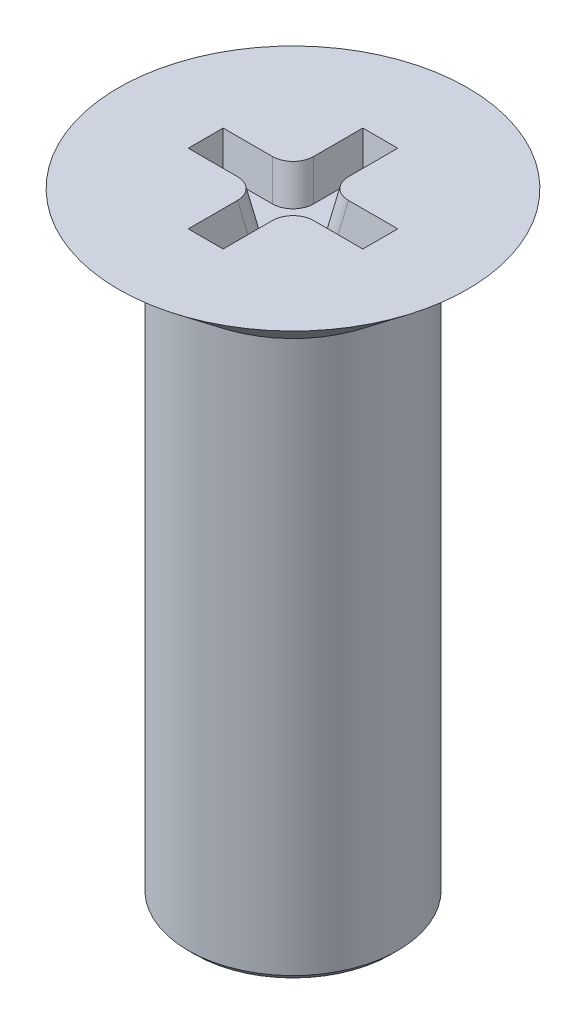
ISO-10303-21;
HEADER;
FILE_DESCRIPTION(('STEP AP214'),'2;1');
FILE_NAME('part.step','',(''),(''),'','','');
FILE_SCHEMA(('AUTOMOTIVE_DESIGN { 1 0 10303 214 1 1 1 1 }'));
ENDSEC;
DATA;
#1=APPLICATION_CONTEXT('core data for automotive mechanical design processes');
#2=APPLICATION_PROTOCOL_DEFINITION('international standard','automotive_design',2000,#1);
#3=PRODUCT_CONTEXT('',#1,'mechanical');
#4=PRODUCT('Part','Part','',(#3));
#5=PRODUCT_RELATED_PRODUCT_CATEGORY('part','',(#4));
#6=PRODUCT_DEFINITION_FORMATION('','',#4);
#7=PRODUCT_DEFINITION_CONTEXT('part definition',#1,'design');
#8=PRODUCT_DEFINITION('design','',#6,#7);
#9=PRODUCT_DEFINITION_SHAPE('','',#8);
#10=(LENGTH_UNIT() NAMED_UNIT(*) SI_UNIT(.MILLI.,.METRE.));
#11=(NAMED_UNIT(*) PLANE_ANGLE_UNIT() SI_UNIT($,.RADIAN.));
#12=(NAMED_UNIT(*) SI_UNIT($,.STERADIAN.) SOLID_ANGLE_UNIT());
#13=UNCERTAINTY_MEASURE_WITH_UNIT(LENGTH_MEASURE(1.E-05),#10,'distance_accuracy_value','');
#14=(GEOMETRIC_REPRESENTATION_CONTEXT(3) GLOBAL_UNCERTAINTY_ASSIGNED_CONTEXT((#13)) GLOBAL_UNIT_ASSIGNED_CONTEXT((#10,
#11,#12)) REPRESENTATION_CONTEXT('',''));
#15=CARTESIAN_POINT('',(0.,0.,0.));
#16=DIRECTION('',(0.,0.,1.));
#17=DIRECTION('',(1.,0.,0.));
#18=AXIS2_PLACEMENT_3D('',#15,#16,#17);
#19=CARTESIAN_POINT('',(0.,0.,0.));
#20=DIRECTION('',(0.,1.,0.));
#21=DIRECTION('',(0.,0.,1.));
#22=AXIS2_PLACEMENT_3D('',#19,#20,#21);
#23=PLANE('',#22);
#24=CARTESIAN_POINT('',(0.,0.,0.));
#25=DIRECTION('',(0.,-1.,0.));
#26=DIRECTION('',(0.,0.,-1.));
#27=AXIS2_PLACEMENT_3D('',#24,#25,#26);
#28=CIRCLE('',#27,2.5);
#29=CARTESIAN_POINT('',(0.,0.,-2.5));
#30=VERTEX_POINT('',#29);
#31=EDGE_CURVE('E256',#30,#30,#28,.T.);
#32=ORIENTED_EDGE('',*,*,#31,.F.);
#33=EDGE_LOOP('',(#32));
#34=FACE_BOUND('',#33,.T.);
#35=DIRECTION('',(1.,0.,0.));
#36=VECTOR('',#35,1.);
#37=CARTESIAN_POINT('',(0.,0.,-0.25));
#38=LINE('',#37,#36);
#39=CARTESIAN_POINT('',(-1.25,0.,-0.25));
#40=VERTEX_POINT('',#39);
#41=CARTESIAN_POINT('',(-0.545442325903662,0.,-0.25));
#42=VERTEX_POINT('',#41);
#43=EDGE_CURVE('E186',#40,#42,#38,.T.);
#44=ORIENTED_EDGE('',*,*,#43,.T.);
#45=CARTESIAN_POINT('',(-0.554627983565723,0.,-0.554627983565723));
#46=DIRECTION('',(0.,1.,0.));
#47=DIRECTION('',(-0.707106781186548,0.,-0.707106781186547));
#48=AXIS2_PLACEMENT_3D('',#45,#46,#47);
#49=ELLIPSE('',#48,0.309186702079241,0.3);
#50=CARTESIAN_POINT('',(-0.25,0.,-0.545442325903662));
#51=VERTEX_POINT('',#50);
#52=EDGE_CURVE('E274',#42,#51,#49,.T.);
#53=ORIENTED_EDGE('',*,*,#52,.T.);
#54=DIRECTION('',(0.,0.,1.));
#55=VECTOR('',#54,1.);
#56=CARTESIAN_POINT('',(-0.25,0.,0.));
#57=LINE('',#56,#55);
#58=CARTESIAN_POINT('',(-0.25,0.,-1.25));
#59=VERTEX_POINT('',#58);
#60=EDGE_CURVE('E184',#59,#51,#57,.T.);
#61=ORIENTED_EDGE('',*,*,#60,.F.);
#62=DIRECTION('',(1.,0.,0.));
#63=VECTOR('',#62,1.);
#64=CARTESIAN_POINT('',(0.,0.,-1.25));
#65=LINE('',#64,#63);
#66=CARTESIAN_POINT('',(0.25,0.,-1.25));
#67=VERTEX_POINT('',#66);
#68=EDGE_CURVE('E163',#59,#67,#65,.T.);
#69=ORIENTED_EDGE('',*,*,#68,.T.);
#70=DIRECTION('',(0.,0.,1.));
#71=VECTOR('',#70,1.);
#72=CARTESIAN_POINT('',(0.25,0.,0.));
#73=LINE('',#72,#71);
#74=CARTESIAN_POINT('',(0.25,0.,-0.545442325903662));
#75=VERTEX_POINT('',#74);
#76=EDGE_CURVE('E175',#67,#75,#73,.T.);
#77=ORIENTED_EDGE('',*,*,#76,.T.);
#78=CARTESIAN_POINT('',(0.554627983565724,0.,-0.554627983565723));
#79=DIRECTION('',(0.,1.,0.));
#80=DIRECTION('',(0.707106781186547,0.,-0.707106781186548));
#81=AXIS2_PLACEMENT_3D('',#78,#79,#80);
#82=ELLIPSE('',#81,0.309186702079241,0.3);
#83=CARTESIAN_POINT('',(0.545442325903663,0.,-0.25));
#84=VERTEX_POINT('',#83);
#85=EDGE_CURVE('E272',#75,#84,#82,.T.);
#86=ORIENTED_EDGE('',*,*,#85,.T.);
#87=DIRECTION('',(1.,0.,0.));
#88=VECTOR('',#87,1.);
#89=CARTESIAN_POINT('',(0.,0.,-0.25));
#90=LINE('',#89,#88);
#91=CARTESIAN_POINT('',(1.25,0.,-0.25));
#92=VERTEX_POINT('',#91);
#93=EDGE_CURVE('E180',#84,#92,#90,.T.);
#94=ORIENTED_EDGE('',*,*,#93,.T.);
#95=DIRECTION('',(0.,0.,-1.));
#96=VECTOR('',#95,1.);
#97=CARTESIAN_POINT('',(1.25,0.,0.));
#98=LINE('',#97,#96);
#99=CARTESIAN_POINT('',(1.25,0.,0.25));
#100=VERTEX_POINT('',#99);
#101=EDGE_CURVE('E206',#100,#92,#98,.T.);
#102=ORIENTED_EDGE('',*,*,#101,.F.);
#103=DIRECTION('',(1.,0.,0.));
#104=VECTOR('',#103,1.);
#105=CARTESIAN_POINT('',(0.,0.,0.25));
#106=LINE('',#105,#104);
#107=CARTESIAN_POINT('',(0.545442325903663,0.,0.25));
#108=VERTEX_POINT('',#107);
#109=EDGE_CURVE('E204',#108,#100,#106,.T.);
#110=ORIENTED_EDGE('',*,*,#109,.F.);
#111=CARTESIAN_POINT('',(0.554627983565724,0.,0.554627983565724));
#112=DIRECTION('',(0.,1.,0.));
#113=DIRECTION('',(0.707106781186548,0.,0.707106781186547));
#114=AXIS2_PLACEMENT_3D('',#111,#112,#113);
#115=ELLIPSE('',#114,0.309186702079241,0.3);
#116=CARTESIAN_POINT('',(0.25,0.,0.545442325903663));
#117=VERTEX_POINT('',#116);
#118=EDGE_CURVE('E268',#108,#117,#115,.T.);
#119=ORIENTED_EDGE('',*,*,#118,.T.);
#120=DIRECTION('',(0.,0.,1.));
#121=VECTOR('',#120,1.);
#122=CARTESIAN_POINT('',(0.25,0.,0.));
#123=LINE('',#122,#121);
#124=CARTESIAN_POINT('',(0.250000000000001,0.,1.25));
#125=VERTEX_POINT('',#124);
#126=EDGE_CURVE('E202',#117,#125,#123,.T.);
#127=ORIENTED_EDGE('',*,*,#126,.T.);
#128=DIRECTION('',(1.,0.,0.));
#129=VECTOR('',#128,1.);
#130=CARTESIAN_POINT('',(0.,0.,1.25));
#131=LINE('',#130,#129);
#132=CARTESIAN_POINT('',(-0.249999999999999,0.,1.25));
#133=VERTEX_POINT('',#132);
#134=EDGE_CURVE('E199',#133,#125,#131,.T.);
#135=ORIENTED_EDGE('',*,*,#134,.F.);
#136=DIRECTION('',(0.,0.,1.));
#137=VECTOR('',#136,1.);
#138=CARTESIAN_POINT('',(-0.25,0.,0.));
#139=LINE('',#138,#137);
#140=CARTESIAN_POINT('',(-0.25,0.,0.545442325903662));
#141=VERTEX_POINT('',#140);
#142=EDGE_CURVE('E197',#141,#133,#139,.T.);
#143=ORIENTED_EDGE('',*,*,#142,.F.);
#144=CARTESIAN_POINT('',(-0.554627983565723,0.,0.554627983565724));
#145=DIRECTION('',(0.,1.,0.));
#146=DIRECTION('',(-0.707106781186547,0.,0.707106781186548));
#147=AXIS2_PLACEMENT_3D('',#144,#145,#146);
#148=ELLIPSE('',#147,0.309186702079241,0.3);
#149=CARTESIAN_POINT('',(-0.545442325903662,0.,0.25));
#150=VERTEX_POINT('',#149);
#151=EDGE_CURVE('E270',#141,#150,#148,.T.);
#152=ORIENTED_EDGE('',*,*,#151,.T.);
#153=DIRECTION('',(1.,0.,0.));
#154=VECTOR('',#153,1.);
#155=CARTESIAN_POINT('',(0.,0.,0.25));
#156=LINE('',#155,#154);
#157=CARTESIAN_POINT('',(-1.25,0.,0.25));
#158=VERTEX_POINT('',#157);
#159=EDGE_CURVE('E194',#158,#150,#156,.T.);
#160=ORIENTED_EDGE('',*,*,#159,.F.);
#161=DIRECTION('',(0.,0.,-1.));
#162=VECTOR('',#161,1.);
#163=CARTESIAN_POINT('',(-1.25,0.,0.));
#164=LINE('',#163,#162);
#165=EDGE_CURVE('E191',#158,#40,#164,.T.);
#166=ORIENTED_EDGE('',*,*,#165,.T.);
#167=EDGE_LOOP('',(#44,#53,#61,#69,#77,#86,#94,#102,#110,#119,#127,#135,#143,#152,#160,#166));
#168=FACE_BOUND('',#167,.T.);
#169=ADVANCED_FACE('F47',(#34,#168),#23,.T.);
#170=CARTESIAN_POINT('',(0.,-0.8,0.));
#171=DIRECTION('',(0.,1.,0.));
#172=DIRECTION('',(0.,0.,1.));
#173=AXIS2_PLACEMENT_3D('',#170,#171,#172);
#174=CONICAL_SURFACE('',#173,1.5,0.896055384571344);
#175=ORIENTED_EDGE('',*,*,#31,.T.);
#176=EDGE_LOOP('',(#175));
#177=FACE_BOUND('',#176,.T.);
#178=CARTESIAN_POINT('',(0.,-0.8,0.));
#179=DIRECTION('',(0.,-1.,0.));
#180=DIRECTION('',(0.,0.,-1.));
#181=AXIS2_PLACEMENT_3D('',#178,#179,#180);
#182=CIRCLE('',#181,1.5);
#183=CARTESIAN_POINT('',(0.,-0.8,-1.5));
#184=VERTEX_POINT('',#183);
#185=EDGE_CURVE('E212',#184,#184,#182,.T.);
#186=ORIENTED_EDGE('',*,*,#185,.F.);
#187=EDGE_LOOP('',(#186));
#188=FACE_BOUND('',#187,.T.);
#189=ADVANCED_FACE('F351',(#177,#188),#174,.T.);
#190=CARTESIAN_POINT('',(0.,-8.8,0.));
#191=DIRECTION('',(0.,1.,0.));
#192=DIRECTION('',(0.,0.,1.));
#193=AXIS2_PLACEMENT_3D('',#190,#191,#192);
#194=CYLINDRICAL_SURFACE('',#193,1.5);
#195=CARTESIAN_POINT('',(0.,-8.7,0.));
#196=DIRECTION('',(0.,-1.,0.));
#197=DIRECTION('',(0.,0.,-1.));
#198=AXIS2_PLACEMENT_3D('',#195,#196,#197);
#199=CIRCLE('',#198,1.5);
#200=CARTESIAN_POINT('',(0.,-8.7,-1.5));
#201=VERTEX_POINT('',#200);
#202=EDGE_CURVE('E262',#201,#201,#199,.F.);
#203=ORIENTED_EDGE('',*,*,#202,.T.);
#204=EDGE_LOOP('',(#203));
#205=FACE_BOUND('',#204,.T.);
#206=ORIENTED_EDGE('',*,*,#185,.T.);
#207=EDGE_LOOP('',(#206));
#208=FACE_BOUND('',#207,.T.);
#209=ADVANCED_FACE('F359',(#205,#208),#194,.T.);
#210=CARTESIAN_POINT('',(0.,-8.8,0.));
#211=DIRECTION('',(0.,-1.,0.));
#212=DIRECTION('',(0.,0.,-1.));
#213=AXIS2_PLACEMENT_3D('',#210,#211,#212);
#214=PLANE('',#213);
#215=CARTESIAN_POINT('',(0.,-8.8,0.));
#216=DIRECTION('',(0.,-1.,0.));
#217=DIRECTION('',(0.,0.,-1.));
#218=AXIS2_PLACEMENT_3D('',#215,#216,#217);
#219=CIRCLE('',#218,1.4);
#220=CARTESIAN_POINT('',(0.,-8.8,-1.4));
#221=VERTEX_POINT('',#220);
#222=EDGE_CURVE('E259',#221,#221,#219,.T.);
#223=ORIENTED_EDGE('',*,*,#222,.T.);
#224=EDGE_LOOP('',(#223));
#225=FACE_BOUND('',#224,.T.);
#226=ADVANCED_FACE('F371',(#225),#214,.T.);
#227=CARTESIAN_POINT('',(0.,-8.8,0.));
#228=DIRECTION('',(0.,1.,0.));
#229=DIRECTION('',(0.,0.,1.));
#230=AXIS2_PLACEMENT_3D('',#227,#228,#229);
#231=CONICAL_SURFACE('',#230,1.4,0.785398163397453);
#232=ORIENTED_EDGE('',*,*,#202,.F.);
#233=EDGE_LOOP('',(#232));
#234=FACE_BOUND('',#233,.T.);
#235=ORIENTED_EDGE('',*,*,#222,.F.);
#236=EDGE_LOOP('',(#235));
#237=FACE_BOUND('',#236,.T.);
#238=ADVANCED_FACE('F366',(#234,#237),#231,.T.);
#239=CARTESIAN_POINT('',(0.,0.,-0.25));
#240=DIRECTION('',(0.,-0.17364817766693,-0.984807753012208));
#241=DIRECTION('',(0.,0.984807753012208,-0.17364817766693));
#242=AXIS2_PLACEMENT_3D('',#239,#240,#241);
#243=PLANE('',#242);
#244=ORIENTED_EDGE('',*,*,#93,.F.);
#245=DIRECTION('',(-0.171087869746036,-0.970287525247814,0.171087869746036));
#246=VECTOR('',#245,1.);
#247=CARTESIAN_POINT('',(0.529476651306003,-0.0905458400836372,-0.234034325402341));
#248=LINE('',#247,#246);
#249=CARTESIAN_POINT('',(0.45727883554943,-0.5,-0.161836509645767));
#250=VERTEX_POINT('',#249);
#251=EDGE_CURVE('E279',#84,#250,#248,.T.);
#252=ORIENTED_EDGE('',*,*,#251,.T.);
#253=DIRECTION('',(-1.,0.,0.));
#254=VECTOR('',#253,1.);
#255=CARTESIAN_POINT('',(0.,-0.5,-0.161836509645767));
#256=LINE('',#255,#254);
#257=CARTESIAN_POINT('',(1.16183650964577,-0.5,-0.161836509645767));
#258=VERTEX_POINT('',#257);
#259=EDGE_CURVE('E209',#250,#258,#256,.F.);
#260=ORIENTED_EDGE('',*,*,#259,.T.);
#261=DIRECTION('',(-0.171087869746036,-0.970287525247814,0.171087869746036));
#262=VECTOR('',#261,1.);
#263=CARTESIAN_POINT('',(1.2134111760322,-0.207505532169751,-0.213411176032204));
#264=LINE('',#263,#262);
#265=EDGE_CURVE('E210',#258,#92,#264,.F.);
#266=ORIENTED_EDGE('',*,*,#265,.T.);
#267=EDGE_LOOP('',(#244,#252,#260,#266));
#268=FACE_BOUND('',#267,.T.);
#269=ADVANCED_FACE('F335',(#268),#243,.F.);
#270=CARTESIAN_POINT('',(1.25,0.,0.));
#271=DIRECTION('',(0.984807753012208,-0.17364817766693,0.));
#272=DIRECTION('',(0.17364817766693,0.984807753012208,0.));
#273=AXIS2_PLACEMENT_3D('',#270,#271,#272);
#274=PLANE('',#273);
#275=ORIENTED_EDGE('',*,*,#101,.T.);
#276=ORIENTED_EDGE('',*,*,#265,.F.);
#277=DIRECTION('',(0.,0.,-1.));
#278=VECTOR('',#277,1.);
#279=CARTESIAN_POINT('',(1.16183650964577,-0.5,0.));
#280=LINE('',#279,#278);
#281=CARTESIAN_POINT('',(1.16183650964577,-0.5,0.161836509645768));
#282=VERTEX_POINT('',#281);
#283=EDGE_CURVE('E171',#282,#258,#280,.T.);
#284=ORIENTED_EDGE('',*,*,#283,.F.);
#285=DIRECTION('',(0.171087869746036,0.970287525247814,0.171087869746036));
#286=VECTOR('',#285,1.);
#287=CARTESIAN_POINT('',(1.2134111760322,-0.207505532169751,0.213411176032205));
#288=LINE('',#287,#286);
#289=EDGE_CURVE('E213',#282,#100,#288,.T.);
#290=ORIENTED_EDGE('',*,*,#289,.T.);
#291=EDGE_LOOP('',(#275,#276,#284,#290));
#292=FACE_BOUND('',#291,.T.);
#293=ADVANCED_FACE('F339',(#292),#274,.F.);
#294=CARTESIAN_POINT('',(0.,0.,0.25));
#295=DIRECTION('',(0.,-0.17364817766693,0.984807753012208));
#296=DIRECTION('',(0.,-0.984807753012208,-0.17364817766693));
#297=AXIS2_PLACEMENT_3D('',#294,#295,#296);
#298=PLANE('',#297);
#299=DIRECTION('',(1.,0.,0.));
#300=VECTOR('',#299,1.);
#301=CARTESIAN_POINT('',(0.,-0.5,0.161836509645768));
#302=LINE('',#301,#300);
#303=CARTESIAN_POINT('',(0.45727883554943,-0.5,0.161836509645768));
#304=VERTEX_POINT('',#303);
#305=EDGE_CURVE('E232',#304,#282,#302,.T.);
#306=ORIENTED_EDGE('',*,*,#305,.F.);
#307=DIRECTION('',(-0.171087869746036,-0.970287525247814,-0.171087869746036));
#308=VECTOR('',#307,1.);
#309=CARTESIAN_POINT('',(0.536794416099563,-0.049044733649687,0.2413520901959));
#310=LINE('',#309,#308);
#311=EDGE_CURVE('E286',#304,#108,#310,.F.);
#312=ORIENTED_EDGE('',*,*,#311,.T.);
#313=ORIENTED_EDGE('',*,*,#109,.T.);
#314=ORIENTED_EDGE('',*,*,#289,.F.);
#315=EDGE_LOOP('',(#306,#312,#313,#314));
#316=FACE_BOUND('',#315,.T.);
#317=ADVANCED_FACE('F343',(#316),#298,.F.);
#318=CARTESIAN_POINT('',(0.25,0.,0.));
#319=DIRECTION('',(0.984807753012208,-0.17364817766693,0.));
#320=DIRECTION('',(0.17364817766693,0.984807753012208,0.));
#321=AXIS2_PLACEMENT_3D('',#318,#319,#320);
#322=PLANE('',#321);
#323=ORIENTED_EDGE('',*,*,#126,.F.);
#324=DIRECTION('',(0.171087869746036,0.970287525247814,0.171087869746036));
#325=VECTOR('',#324,1.);
#326=CARTESIAN_POINT('',(0.153188599841668,-0.549044733649687,0.44863092574533));
#327=LINE('',#326,#325);
#328=CARTESIAN_POINT('',(0.161836509645768,-0.5,0.45727883554943));
#329=VERTEX_POINT('',#328);
#330=EDGE_CURVE('E62',#117,#329,#327,.F.);
#331=ORIENTED_EDGE('',*,*,#330,.T.);
#332=DIRECTION('',(0.,0.,-1.));
#333=VECTOR('',#332,1.);
#334=CARTESIAN_POINT('',(0.161836509645768,-0.5,0.));
#335=LINE('',#334,#333);
#336=CARTESIAN_POINT('',(0.161836509645768,-0.5,1.16183650964577));
#337=VERTEX_POINT('',#336);
#338=EDGE_CURVE('E234',#329,#337,#335,.F.);
#339=ORIENTED_EDGE('',*,*,#338,.T.);
#340=DIRECTION('',(-0.171087869746036,-0.970287525247814,-0.171087869746036));
#341=VECTOR('',#340,1.);
#342=CARTESIAN_POINT('',(0.213411176032205,-0.207505532169751,1.2134111760322));
#343=LINE('',#342,#341);
#344=EDGE_CURVE('E223',#337,#125,#343,.F.);
#345=ORIENTED_EDGE('',*,*,#344,.T.);
#346=EDGE_LOOP('',(#323,#331,#339,#345));
#347=FACE_BOUND('',#346,.T.);
#348=ADVANCED_FACE('F461',(#347),#322,.F.);
#349=CARTESIAN_POINT('',(0.,0.,1.25));
#350=DIRECTION('',(0.,-0.17364817766693,0.984807753012208));
#351=DIRECTION('',(0.,-0.984807753012208,-0.17364817766693));
#352=AXIS2_PLACEMENT_3D('',#349,#350,#351);
#353=PLANE('',#352);
#354=ORIENTED_EDGE('',*,*,#134,.T.);
#355=ORIENTED_EDGE('',*,*,#344,.F.);
#356=DIRECTION('',(1.,0.,0.));
#357=VECTOR('',#356,1.);
#358=CARTESIAN_POINT('',(0.,-0.5,1.16183650964577));
#359=LINE('',#358,#357);
#360=CARTESIAN_POINT('',(-0.161836509645767,-0.5,1.16183650964577));
#361=VERTEX_POINT('',#360);
#362=EDGE_CURVE('E236',#361,#337,#359,.T.);
#363=ORIENTED_EDGE('',*,*,#362,.F.);
#364=DIRECTION('',(-0.171087869746036,0.970287525247814,0.171087869746036));
#365=VECTOR('',#364,1.);
#366=CARTESIAN_POINT('',(-0.213411176032204,-0.207505532169751,1.2134111760322));
#367=LINE('',#366,#365);
#368=EDGE_CURVE('E220',#361,#133,#367,.T.);
#369=ORIENTED_EDGE('',*,*,#368,.T.);
#370=EDGE_LOOP('',(#354,#355,#363,#369));
#371=FACE_BOUND('',#370,.T.);
#372=ADVANCED_FACE('F453',(#371),#353,.F.);
#373=CARTESIAN_POINT('',(-0.25,0.,0.));
#374=DIRECTION('',(-0.984807753012208,-0.17364817766693,0.));
#375=DIRECTION('',(0.17364817766693,-0.984807753012208,0.));
#376=AXIS2_PLACEMENT_3D('',#373,#374,#375);
#377=PLANE('',#376);
#378=DIRECTION('',(0.,0.,1.));
#379=VECTOR('',#378,1.);
#380=CARTESIAN_POINT('',(-0.161836509645767,-0.5,0.));
#381=LINE('',#380,#379);
#382=CARTESIAN_POINT('',(-0.161836509645767,-0.5,0.45727883554943));
#383=VERTEX_POINT('',#382);
#384=EDGE_CURVE('E239',#383,#361,#381,.T.);
#385=ORIENTED_EDGE('',*,*,#384,.F.);
#386=DIRECTION('',(-0.171087869746036,0.970287525247814,0.171087869746036));
#387=VECTOR('',#386,1.);
#388=CARTESIAN_POINT('',(-0.23403432540234,-0.0905458400836372,0.529476651306003));
#389=LINE('',#388,#387);
#390=EDGE_CURVE('E281',#383,#141,#389,.T.);
#391=ORIENTED_EDGE('',*,*,#390,.T.);
#392=ORIENTED_EDGE('',*,*,#142,.T.);
#393=ORIENTED_EDGE('',*,*,#368,.F.);
#394=EDGE_LOOP('',(#385,#391,#392,#393));
#395=FACE_BOUND('',#394,.T.);
#396=ADVANCED_FACE('F304',(#395),#377,.F.);
#397=CARTESIAN_POINT('',(0.,0.,0.25));
#398=DIRECTION('',(0.,-0.17364817766693,0.984807753012208));
#399=DIRECTION('',(0.,-0.984807753012208,-0.17364817766693));
#400=AXIS2_PLACEMENT_3D('',#397,#398,#399);
#401=PLANE('',#400);
#402=ORIENTED_EDGE('',*,*,#159,.T.);
#403=DIRECTION('',(-0.171087869746036,0.970287525247814,0.171087869746036));
#404=VECTOR('',#403,1.);
#405=CARTESIAN_POINT('',(-0.529476651306003,-0.0905458400836371,0.234034325402341));
#406=LINE('',#405,#404);
#407=CARTESIAN_POINT('',(-0.457278835549429,-0.5,0.161836509645768));
#408=VERTEX_POINT('',#407);
#409=EDGE_CURVE('E284',#150,#408,#406,.F.);
#410=ORIENTED_EDGE('',*,*,#409,.T.);
#411=DIRECTION('',(1.,0.,0.));
#412=VECTOR('',#411,1.);
#413=CARTESIAN_POINT('',(0.,-0.5,0.161836509645768));
#414=LINE('',#413,#412);
#415=CARTESIAN_POINT('',(-1.16183650964577,-0.5,0.161836509645768));
#416=VERTEX_POINT('',#415);
#417=EDGE_CURVE('E241',#416,#408,#414,.T.);
#418=ORIENTED_EDGE('',*,*,#417,.F.);
#419=DIRECTION('',(0.171087869746036,-0.970287525247814,-0.171087869746036));
#420=VECTOR('',#419,1.);
#421=CARTESIAN_POINT('',(-1.2134111760322,-0.207505532169751,0.213411176032205));
#422=LINE('',#421,#420);
#423=EDGE_CURVE('E218',#416,#158,#422,.F.);
#424=ORIENTED_EDGE('',*,*,#423,.T.);
#425=EDGE_LOOP('',(#402,#410,#418,#424));
#426=FACE_BOUND('',#425,.T.);
#427=ADVANCED_FACE('F311',(#426),#401,.F.);
#428=CARTESIAN_POINT('',(-1.25,0.,0.));
#429=DIRECTION('',(-0.984807753012208,-0.17364817766693,0.));
#430=DIRECTION('',(0.17364817766693,-0.984807753012208,0.));
#431=AXIS2_PLACEMENT_3D('',#428,#429,#430);
#432=PLANE('',#431);
#433=ORIENTED_EDGE('',*,*,#165,.F.);
#434=ORIENTED_EDGE('',*,*,#423,.F.);
#435=DIRECTION('',(0.,0.,1.));
#436=VECTOR('',#435,1.);
#437=CARTESIAN_POINT('',(-1.16183650964577,-0.5,0.));
#438=LINE('',#437,#436);
#439=CARTESIAN_POINT('',(-1.16183650964577,-0.5,-0.161836509645767));
#440=VERTEX_POINT('',#439);
#441=EDGE_CURVE('E244',#416,#440,#438,.F.);
#442=ORIENTED_EDGE('',*,*,#441,.T.);
#443=DIRECTION('',(-0.171087869746036,0.970287525247814,-0.171087869746036));
#444=VECTOR('',#443,1.);
#445=CARTESIAN_POINT('',(-1.2134111760322,-0.207505532169751,-0.213411176032204));
#446=LINE('',#445,#444);
#447=EDGE_CURVE('E216',#440,#40,#446,.T.);
#448=ORIENTED_EDGE('',*,*,#447,.T.);
#449=EDGE_LOOP('',(#433,#434,#442,#448));
#450=FACE_BOUND('',#449,.T.);
#451=ADVANCED_FACE('F314',(#450),#432,.F.);
#452=CARTESIAN_POINT('',(0.,0.,-0.25));
#453=DIRECTION('',(0.,-0.17364817766693,-0.984807753012208));
#454=DIRECTION('',(0.,0.984807753012208,-0.17364817766693));
#455=AXIS2_PLACEMENT_3D('',#452,#453,#454);
#456=PLANE('',#455);
#457=DIRECTION('',(-1.,0.,0.));
#458=VECTOR('',#457,1.);
#459=CARTESIAN_POINT('',(0.,-0.5,-0.161836509645767));
#460=LINE('',#459,#458);
#461=CARTESIAN_POINT('',(-0.457278835549429,-0.5,-0.161836509645767));
#462=VERTEX_POINT('',#461);
#463=EDGE_CURVE('E246',#440,#462,#460,.F.);
#464=ORIENTED_EDGE('',*,*,#463,.T.);
#465=DIRECTION('',(-0.171087869746036,0.970287525247814,-0.171087869746036));
#466=VECTOR('',#465,1.);
#467=CARTESIAN_POINT('',(-0.536794416099562,-0.0490447336496869,-0.2413520901959));
#468=LINE('',#467,#466);
#469=EDGE_CURVE('E265',#462,#42,#468,.T.);
#470=ORIENTED_EDGE('',*,*,#469,.T.);
#471=ORIENTED_EDGE('',*,*,#43,.F.);
#472=ORIENTED_EDGE('',*,*,#447,.F.);
#473=EDGE_LOOP('',(#464,#470,#471,#472));
#474=FACE_BOUND('',#473,.T.);
#475=ADVANCED_FACE('F318',(#474),#456,.F.);
#476=CARTESIAN_POINT('',(-0.25,0.,0.));
#477=DIRECTION('',(-0.984807753012208,-0.17364817766693,0.));
#478=DIRECTION('',(0.17364817766693,-0.984807753012208,0.));
#479=AXIS2_PLACEMENT_3D('',#476,#477,#478);
#480=PLANE('',#479);
#481=ORIENTED_EDGE('',*,*,#60,.T.);
#482=DIRECTION('',(0.171087869746036,-0.970287525247814,0.171087869746036));
#483=VECTOR('',#482,1.);
#484=CARTESIAN_POINT('',(-0.153188599841667,-0.549044733649687,-0.44863092574533));
#485=LINE('',#484,#483);
#486=CARTESIAN_POINT('',(-0.161836509645767,-0.5,-0.45727883554943));
#487=VERTEX_POINT('',#486);
#488=EDGE_CURVE('E276',#51,#487,#485,.T.);
#489=ORIENTED_EDGE('',*,*,#488,.T.);
#490=DIRECTION('',(0.,0.,1.));
#491=VECTOR('',#490,1.);
#492=CARTESIAN_POINT('',(-0.161836509645767,-0.5,0.));
#493=LINE('',#492,#491);
#494=CARTESIAN_POINT('',(-0.161836509645767,-0.5,-1.16183650964577));
#495=VERTEX_POINT('',#494);
#496=EDGE_CURVE('E249',#495,#487,#493,.T.);
#497=ORIENTED_EDGE('',*,*,#496,.F.);
#498=DIRECTION('',(0.171087869746036,-0.970287525247814,0.171087869746036));
#499=VECTOR('',#498,1.);
#500=CARTESIAN_POINT('',(-0.213411176032204,-0.207505532169751,-1.2134111760322));
#501=LINE('',#500,#499);
#502=EDGE_CURVE('E170',#495,#59,#501,.F.);
#503=ORIENTED_EDGE('',*,*,#502,.T.);
#504=EDGE_LOOP('',(#481,#489,#497,#503));
#505=FACE_BOUND('',#504,.T.);
#506=ADVANCED_FACE('F327',(#505),#480,.F.);
#507=CARTESIAN_POINT('',(0.,0.,-1.25));
#508=DIRECTION('',(0.,-0.17364817766693,-0.984807753012208));
#509=DIRECTION('',(0.,0.984807753012208,-0.17364817766693));
#510=AXIS2_PLACEMENT_3D('',#507,#508,#509);
#511=PLANE('',#510);
#512=ORIENTED_EDGE('',*,*,#68,.F.);
#513=ORIENTED_EDGE('',*,*,#502,.F.);
#514=DIRECTION('',(-1.,0.,0.));
#515=VECTOR('',#514,1.);
#516=CARTESIAN_POINT('',(0.,-0.5,-1.16183650964577));
#517=LINE('',#516,#515);
#518=CARTESIAN_POINT('',(0.161836509645768,-0.5,-1.16183650964577));
#519=VERTEX_POINT('',#518);
#520=EDGE_CURVE('E166',#495,#519,#517,.F.);
#521=ORIENTED_EDGE('',*,*,#520,.T.);
#522=DIRECTION('',(0.171087869746036,0.970287525247814,-0.171087869746036));
#523=VECTOR('',#522,1.);
#524=CARTESIAN_POINT('',(0.213411176032205,-0.207505532169751,-1.2134111760322));
#525=LINE('',#524,#523);
#526=EDGE_CURVE('E159',#519,#67,#525,.T.);
#527=ORIENTED_EDGE('',*,*,#526,.T.);
#528=EDGE_LOOP('',(#512,#513,#521,#527));
#529=FACE_BOUND('',#528,.T.);
#530=ADVANCED_FACE('F161',(#529),#511,.F.);
#531=CARTESIAN_POINT('',(0.25,0.,0.));
#532=DIRECTION('',(0.984807753012208,-0.17364817766693,0.));
#533=DIRECTION('',(0.17364817766693,0.984807753012208,0.));
#534=AXIS2_PLACEMENT_3D('',#531,#532,#533);
#535=PLANE('',#534);
#536=DIRECTION('',(0.,0.,-1.));
#537=VECTOR('',#536,1.);
#538=CARTESIAN_POINT('',(0.161836509645768,-0.5,0.));
#539=LINE('',#538,#537);
#540=CARTESIAN_POINT('',(0.161836509645768,-0.5,-0.45727883554943));
#541=VERTEX_POINT('',#540);
#542=EDGE_CURVE('E229',#519,#541,#539,.F.);
#543=ORIENTED_EDGE('',*,*,#542,.T.);
#544=DIRECTION('',(-0.171087869746036,-0.970287525247814,0.171087869746036));
#545=VECTOR('',#544,1.);
#546=CARTESIAN_POINT('',(0.234034325402341,-0.0905458400836371,-0.529476651306003));
#547=LINE('',#546,#545);
#548=EDGE_CURVE('E178',#541,#75,#547,.F.);
#549=ORIENTED_EDGE('',*,*,#548,.T.);
#550=ORIENTED_EDGE('',*,*,#76,.F.);
#551=ORIENTED_EDGE('',*,*,#526,.F.);
#552=EDGE_LOOP('',(#543,#549,#550,#551));
#553=FACE_BOUND('',#552,.T.);
#554=ADVANCED_FACE('F176',(#553),#535,.F.);
#555=CARTESIAN_POINT('',(0.,-0.5,0.));
#556=DIRECTION('',(0.,1.,0.));
#557=DIRECTION('',(0.,0.,1.));
#558=AXIS2_PLACEMENT_3D('',#555,#556,#557);
#559=PLANE('',#558);
#560=ORIENTED_EDGE('',*,*,#259,.F.);
#561=CARTESIAN_POINT('',(0.466464493211491,-0.5,-0.466464493211491));
#562=DIRECTION('',(0.,1.,0.));
#563=DIRECTION('',(0.707106781186547,0.,-0.707106781186548));
#564=AXIS2_PLACEMENT_3D('',#561,#562,#563);
#565=ELLIPSE('',#564,0.309186702079241,0.3);
#566=EDGE_CURVE('E292',#250,#541,#565,.F.);
#567=ORIENTED_EDGE('',*,*,#566,.T.);
#568=ORIENTED_EDGE('',*,*,#542,.F.);
#569=ORIENTED_EDGE('',*,*,#520,.F.);
#570=ORIENTED_EDGE('',*,*,#496,.T.);
#571=CARTESIAN_POINT('',(-0.466464493211491,-0.5,-0.466464493211491));
#572=DIRECTION('',(0.,1.,0.));
#573=DIRECTION('',(-0.707106781186548,0.,-0.707106781186547));
#574=AXIS2_PLACEMENT_3D('',#571,#572,#573);
#575=ELLIPSE('',#574,0.309186702079241,0.3);
#576=EDGE_CURVE('E290',#487,#462,#575,.F.);
#577=ORIENTED_EDGE('',*,*,#576,.T.);
#578=ORIENTED_EDGE('',*,*,#463,.F.);
#579=ORIENTED_EDGE('',*,*,#441,.F.);
#580=ORIENTED_EDGE('',*,*,#417,.T.);
#581=CARTESIAN_POINT('',(-0.46646449321149,-0.5,0.466464493211491));
#582=DIRECTION('',(0.,1.,0.));
#583=DIRECTION('',(-0.707106781186547,0.,0.707106781186548));
#584=AXIS2_PLACEMENT_3D('',#581,#582,#583);
#585=ELLIPSE('',#584,0.309186702079241,0.3);
#586=EDGE_CURVE('E55',#408,#383,#585,.F.);
#587=ORIENTED_EDGE('',*,*,#586,.T.);
#588=ORIENTED_EDGE('',*,*,#384,.T.);
#589=ORIENTED_EDGE('',*,*,#362,.T.);
#590=ORIENTED_EDGE('',*,*,#338,.F.);
#591=CARTESIAN_POINT('',(0.466464493211491,-0.5,0.466464493211491));
#592=DIRECTION('',(0.,1.,0.));
#593=DIRECTION('',(0.707106781186548,0.,0.707106781186547));
#594=AXIS2_PLACEMENT_3D('',#591,#592,#593);
#595=ELLIPSE('',#594,0.309186702079241,0.3);
#596=EDGE_CURVE('E11',#329,#304,#595,.F.);
#597=ORIENTED_EDGE('',*,*,#596,.T.);
#598=ORIENTED_EDGE('',*,*,#305,.T.);
#599=ORIENTED_EDGE('',*,*,#283,.T.);
#600=EDGE_LOOP('',(#560,#567,#568,#569,#570,#577,#578,#579,#580,#587,#588,#589,#590,#597,#598,#599));
#601=FACE_BOUND('',#600,.T.);
#602=ADVANCED_FACE('F296',(#601),#559,.T.);
#603=CARTESIAN_POINT('',(-0.529476651306003,-0.142640293383716,-0.529476651306003));
#604=DIRECTION('',(-0.171087869746036,0.970287525247814,-0.171087869746036));
#605=DIRECTION('',(-0.984807753012208,-0.17364817766693,0.));
#606=AXIS2_PLACEMENT_3D('',#603,#604,#605);
#607=CYLINDRICAL_SURFACE('',#606,0.3);
#608=ORIENTED_EDGE('',*,*,#576,.F.);
#609=ORIENTED_EDGE('',*,*,#488,.F.);
#610=ORIENTED_EDGE('',*,*,#52,.F.);
#611=ORIENTED_EDGE('',*,*,#469,.F.);
#612=EDGE_LOOP('',(#608,#609,#610,#611));
#613=FACE_BOUND('',#612,.T.);
#614=ADVANCED_FACE('F323',(#613),#607,.T.);
#615=CARTESIAN_POINT('',(0.529476651306003,-0.142640293383716,-0.529476651306003));
#616=DIRECTION('',(0.171087869746036,0.970287525247814,-0.171087869746036));
#617=DIRECTION('',(0.,0.17364817766693,0.984807753012208));
#618=AXIS2_PLACEMENT_3D('',#615,#616,#617);
#619=CYLINDRICAL_SURFACE('',#618,0.3);
#620=ORIENTED_EDGE('',*,*,#566,.F.);
#621=ORIENTED_EDGE('',*,*,#251,.F.);
#622=ORIENTED_EDGE('',*,*,#85,.F.);
#623=ORIENTED_EDGE('',*,*,#548,.F.);
#624=EDGE_LOOP('',(#620,#621,#622,#623));
#625=FACE_BOUND('',#624,.T.);
#626=ADVANCED_FACE('F330',(#625),#619,.T.);
#627=CARTESIAN_POINT('',(-0.529476651306003,-0.142640293383716,0.529476651306003));
#628=DIRECTION('',(-0.171087869746036,0.970287525247814,0.171087869746036));
#629=DIRECTION('',(0.,-0.17364817766693,0.984807753012208));
#630=AXIS2_PLACEMENT_3D('',#627,#628,#629);
#631=CYLINDRICAL_SURFACE('',#630,0.3);
#632=ORIENTED_EDGE('',*,*,#586,.F.);
#633=ORIENTED_EDGE('',*,*,#409,.F.);
#634=ORIENTED_EDGE('',*,*,#151,.F.);
#635=ORIENTED_EDGE('',*,*,#390,.F.);
#636=EDGE_LOOP('',(#632,#633,#634,#635));
#637=FACE_BOUND('',#636,.T.);
#638=ADVANCED_FACE('F307',(#637),#631,.T.);
#639=CARTESIAN_POINT('',(0.529476651306004,-0.142640293383716,0.529476651306003));
#640=DIRECTION('',(0.171087869746036,0.970287525247814,0.171087869746036));
#641=DIRECTION('',(-0.984807753012208,0.17364817766693,0.));
#642=AXIS2_PLACEMENT_3D('',#639,#640,#641);
#643=CYLINDRICAL_SURFACE('',#642,0.3);
#644=ORIENTED_EDGE('',*,*,#596,.F.);
#645=ORIENTED_EDGE('',*,*,#330,.F.);
#646=ORIENTED_EDGE('',*,*,#118,.F.);
#647=ORIENTED_EDGE('',*,*,#311,.F.);
#648=EDGE_LOOP('',(#644,#645,#646,#647));
#649=FACE_BOUND('',#648,.T.);
#650=ADVANCED_FACE('F49',(#649),#643,.T.);
#651=CLOSED_SHELL('',(#169,#189,#209,#226,#238,#269,#293,#317,#348,#372,#396,#427,#451,#475,
#506,#530,#554,#602,#614,#626,#638,#650));
#652=MANIFOLD_SOLID_BREP('B2',#651);
#653=ADVANCED_BREP_SHAPE_REPRESENTATION('',(#18,#652),#14);
#654=SHAPE_DEFINITION_REPRESENTATION(#9,#653);
ENDSEC;
END-ISO-10303-21;
